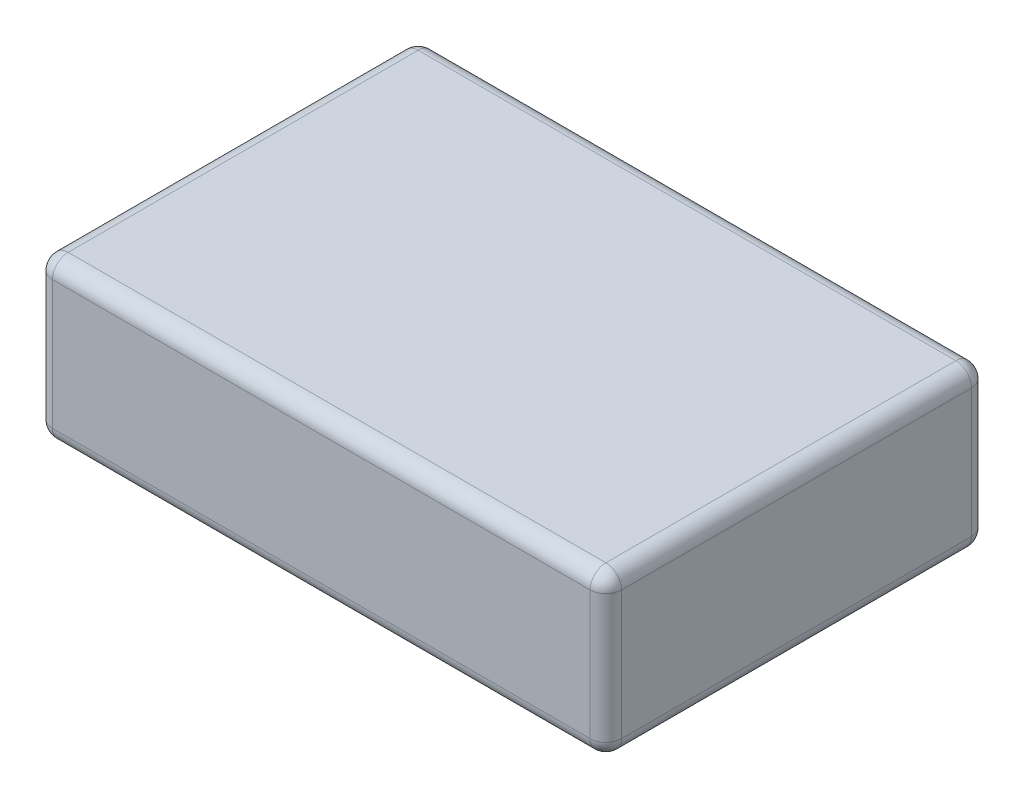
ISO-10303-21;
HEADER;
FILE_DESCRIPTION(('STEP AP214'),'2;1');
FILE_NAME('part.step','',(''),(''),'','','');
FILE_SCHEMA(('AUTOMOTIVE_DESIGN { 1 0 10303 214 1 1 1 1 }'));
ENDSEC;
DATA;
#1=APPLICATION_CONTEXT('core data for automotive mechanical design processes');
#2=APPLICATION_PROTOCOL_DEFINITION('international standard','automotive_design',2000,#1);
#3=PRODUCT_CONTEXT('',#1,'mechanical');
#4=PRODUCT('Part','Part','',(#3));
#5=PRODUCT_RELATED_PRODUCT_CATEGORY('part','',(#4));
#6=PRODUCT_DEFINITION_FORMATION('','',#4);
#7=PRODUCT_DEFINITION_CONTEXT('part definition',#1,'design');
#8=PRODUCT_DEFINITION('design','',#6,#7);
#9=PRODUCT_DEFINITION_SHAPE('','',#8);
#10=(LENGTH_UNIT() NAMED_UNIT(*) SI_UNIT(.MILLI.,.METRE.));
#11=(NAMED_UNIT(*) PLANE_ANGLE_UNIT() SI_UNIT($,.RADIAN.));
#12=(NAMED_UNIT(*) SI_UNIT($,.STERADIAN.) SOLID_ANGLE_UNIT());
#13=UNCERTAINTY_MEASURE_WITH_UNIT(LENGTH_MEASURE(1.E-05),#10,'distance_accuracy_value','');
#14=(GEOMETRIC_REPRESENTATION_CONTEXT(3) GLOBAL_UNCERTAINTY_ASSIGNED_CONTEXT((#13)) GLOBAL_UNIT_ASSIGNED_CONTEXT((#10,
#11,#12)) REPRESENTATION_CONTEXT('',''));
#15=CARTESIAN_POINT('',(0.,0.,0.));
#16=DIRECTION('',(0.,0.,1.));
#17=DIRECTION('',(1.,0.,0.));
#18=AXIS2_PLACEMENT_3D('',#15,#16,#17);
#19=CARTESIAN_POINT('',(46.0121,25.908,-30.8356));
#20=DIRECTION('',(-1.,0.,0.));
#21=DIRECTION('',(0.,0.,1.));
#22=AXIS2_PLACEMENT_3D('',#19,#20,#21);
#23=PLANE('',#22);
#24=DIRECTION('',(0.,0.,-1.));
#25=VECTOR('',#24,1.);
#26=CARTESIAN_POINT('',(46.0121,2.54,-30.8356));
#27=LINE('',#26,#25);
#28=CARTESIAN_POINT('',(46.0121,2.54,28.2956));
#29=VERTEX_POINT('',#28);
#30=CARTESIAN_POINT('',(46.0121,2.54,-28.2956));
#31=VERTEX_POINT('',#30);
#32=EDGE_CURVE('E188',#29,#31,#27,.T.);
#33=ORIENTED_EDGE('',*,*,#32,.T.);
#34=DIRECTION('',(0.,-1.,0.));
#35=VECTOR('',#34,1.);
#36=CARTESIAN_POINT('',(46.0121,25.908,-28.2956));
#37=LINE('',#36,#35);
#38=CARTESIAN_POINT('',(46.0121,23.368,-28.2956));
#39=VERTEX_POINT('',#38);
#40=EDGE_CURVE('E190',#31,#39,#37,.F.);
#41=ORIENTED_EDGE('',*,*,#40,.T.);
#42=DIRECTION('',(0.,0.,-1.));
#43=VECTOR('',#42,1.);
#44=CARTESIAN_POINT('',(46.0121,23.368,30.8356));
#45=LINE('',#44,#43);
#46=CARTESIAN_POINT('',(46.0121,23.368,28.2956));
#47=VERTEX_POINT('',#46);
#48=EDGE_CURVE('E186',#39,#47,#45,.F.);
#49=ORIENTED_EDGE('',*,*,#48,.T.);
#50=DIRECTION('',(0.,-1.,0.));
#51=VECTOR('',#50,1.);
#52=CARTESIAN_POINT('',(46.0121,25.908,28.2956));
#53=LINE('',#52,#51);
#54=EDGE_CURVE('E184',#47,#29,#53,.T.);
#55=ORIENTED_EDGE('',*,*,#54,.T.);
#56=EDGE_LOOP('',(#33,#41,#49,#55));
#57=FACE_BOUND('',#56,.T.);
#58=ADVANCED_FACE('F33',(#57),#23,.F.);
#59=CARTESIAN_POINT('',(-46.0121,25.908,-30.8356));
#60=DIRECTION('',(0.,0.,1.));
#61=DIRECTION('',(1.,0.,0.));
#62=AXIS2_PLACEMENT_3D('',#59,#60,#61);
#63=PLANE('',#62);
#64=DIRECTION('',(-1.,0.,0.));
#65=VECTOR('',#64,1.);
#66=CARTESIAN_POINT('',(-46.0121,2.54,-30.8356));
#67=LINE('',#66,#65);
#68=CARTESIAN_POINT('',(43.4721,2.54,-30.8356));
#69=VERTEX_POINT('',#68);
#70=CARTESIAN_POINT('',(-43.4721,2.54,-30.8356));
#71=VERTEX_POINT('',#70);
#72=EDGE_CURVE('E179',#69,#71,#67,.T.);
#73=ORIENTED_EDGE('',*,*,#72,.T.);
#74=DIRECTION('',(0.,-1.,0.));
#75=VECTOR('',#74,1.);
#76=CARTESIAN_POINT('',(-43.4721,25.908,-30.8356));
#77=LINE('',#76,#75);
#78=CARTESIAN_POINT('',(-43.4721,23.368,-30.8356));
#79=VERTEX_POINT('',#78);
#80=EDGE_CURVE('E181',#71,#79,#77,.F.);
#81=ORIENTED_EDGE('',*,*,#80,.T.);
#82=DIRECTION('',(-1.,0.,0.));
#83=VECTOR('',#82,1.);
#84=CARTESIAN_POINT('',(46.0121,23.368,-30.8356));
#85=LINE('',#84,#83);
#86=CARTESIAN_POINT('',(43.4721,23.368,-30.8356));
#87=VERTEX_POINT('',#86);
#88=EDGE_CURVE('E177',#79,#87,#85,.F.);
#89=ORIENTED_EDGE('',*,*,#88,.T.);
#90=DIRECTION('',(0.,-1.,0.));
#91=VECTOR('',#90,1.);
#92=CARTESIAN_POINT('',(43.4721,25.908,-30.8356));
#93=LINE('',#92,#91);
#94=EDGE_CURVE('E175',#87,#69,#93,.T.);
#95=ORIENTED_EDGE('',*,*,#94,.T.);
#96=EDGE_LOOP('',(#73,#81,#89,#95));
#97=FACE_BOUND('',#96,.T.);
#98=ADVANCED_FACE('F285',(#97),#63,.F.);
#99=CARTESIAN_POINT('',(-46.0121,25.908,-30.8356));
#100=DIRECTION('',(1.,0.,0.));
#101=DIRECTION('',(0.,0.,-1.));
#102=AXIS2_PLACEMENT_3D('',#99,#100,#101);
#103=PLANE('',#102);
#104=DIRECTION('',(0.,0.,1.));
#105=VECTOR('',#104,1.);
#106=CARTESIAN_POINT('',(-46.0121,23.368,-30.8356));
#107=LINE('',#106,#105);
#108=CARTESIAN_POINT('',(-46.0121,23.368,28.2956));
#109=VERTEX_POINT('',#108);
#110=CARTESIAN_POINT('',(-46.0121,23.368,-28.2956));
#111=VERTEX_POINT('',#110);
#112=EDGE_CURVE('E149',#109,#111,#107,.F.);
#113=ORIENTED_EDGE('',*,*,#112,.T.);
#114=DIRECTION('',(0.,-1.,0.));
#115=VECTOR('',#114,1.);
#116=CARTESIAN_POINT('',(-46.0121,25.908,-28.2956));
#117=LINE('',#116,#115);
#118=CARTESIAN_POINT('',(-46.0121,2.54,-28.2956));
#119=VERTEX_POINT('',#118);
#120=EDGE_CURVE('E153',#111,#119,#117,.T.);
#121=ORIENTED_EDGE('',*,*,#120,.T.);
#122=DIRECTION('',(0.,0.,1.));
#123=VECTOR('',#122,1.);
#124=CARTESIAN_POINT('',(-46.0121,2.54,-30.8356));
#125=LINE('',#124,#123);
#126=CARTESIAN_POINT('',(-46.0121,2.54,28.2956));
#127=VERTEX_POINT('',#126);
#128=EDGE_CURVE('E126',#119,#127,#125,.T.);
#129=ORIENTED_EDGE('',*,*,#128,.T.);
#130=DIRECTION('',(0.,-1.,0.));
#131=VECTOR('',#130,1.);
#132=CARTESIAN_POINT('',(-46.0121,25.908,28.2956));
#133=LINE('',#132,#131);
#134=EDGE_CURVE('E143',#127,#109,#133,.F.);
#135=ORIENTED_EDGE('',*,*,#134,.T.);
#136=EDGE_LOOP('',(#113,#121,#129,#135));
#137=FACE_BOUND('',#136,.T.);
#138=ADVANCED_FACE('F151',(#137),#103,.F.);
#139=CARTESIAN_POINT('',(-46.0121,25.908,30.8356));
#140=DIRECTION('',(0.,0.,-1.));
#141=DIRECTION('',(-1.,0.,0.));
#142=AXIS2_PLACEMENT_3D('',#139,#140,#141);
#143=PLANE('',#142);
#144=DIRECTION('',(1.,0.,0.));
#145=VECTOR('',#144,1.);
#146=CARTESIAN_POINT('',(-46.0121,2.54,30.8356));
#147=LINE('',#146,#145);
#148=CARTESIAN_POINT('',(-43.4721,2.54,30.8356));
#149=VERTEX_POINT('',#148);
#150=CARTESIAN_POINT('',(43.4721,2.54,30.8356));
#151=VERTEX_POINT('',#150);
#152=EDGE_CURVE('E42',#149,#151,#147,.T.);
#153=ORIENTED_EDGE('',*,*,#152,.T.);
#154=DIRECTION('',(0.,-1.,0.));
#155=VECTOR('',#154,1.);
#156=CARTESIAN_POINT('',(43.4721,25.908,30.8356));
#157=LINE('',#156,#155);
#158=CARTESIAN_POINT('',(43.4721,23.368,30.8356));
#159=VERTEX_POINT('',#158);
#160=EDGE_CURVE('E11',#151,#159,#157,.F.);
#161=ORIENTED_EDGE('',*,*,#160,.T.);
#162=DIRECTION('',(1.,0.,0.));
#163=VECTOR('',#162,1.);
#164=CARTESIAN_POINT('',(-46.0121,23.368,30.8356));
#165=LINE('',#164,#163);
#166=CARTESIAN_POINT('',(-43.4721,23.368,30.8356));
#167=VERTEX_POINT('',#166);
#168=EDGE_CURVE('E193',#159,#167,#165,.F.);
#169=ORIENTED_EDGE('',*,*,#168,.T.);
#170=DIRECTION('',(0.,-1.,0.));
#171=VECTOR('',#170,1.);
#172=CARTESIAN_POINT('',(-43.4721,25.908,30.8356));
#173=LINE('',#172,#171);
#174=EDGE_CURVE('E53',#167,#149,#173,.T.);
#175=ORIENTED_EDGE('',*,*,#174,.T.);
#176=EDGE_LOOP('',(#153,#161,#169,#175));
#177=FACE_BOUND('',#176,.T.);
#178=ADVANCED_FACE('F312',(#177),#143,.F.);
#179=CARTESIAN_POINT('',(0.,25.908,0.));
#180=DIRECTION('',(0.,1.,0.));
#181=DIRECTION('',(0.,0.,1.));
#182=AXIS2_PLACEMENT_3D('',#179,#180,#181);
#183=PLANE('',#182);
#184=DIRECTION('',(-1.,0.,0.));
#185=VECTOR('',#184,1.);
#186=CARTESIAN_POINT('',(-46.0121,25.908,-28.2956));
#187=LINE('',#186,#185);
#188=CARTESIAN_POINT('',(43.4721,25.908,-28.2956));
#189=VERTEX_POINT('',#188);
#190=CARTESIAN_POINT('',(-43.4721,25.908,-28.2956));
#191=VERTEX_POINT('',#190);
#192=EDGE_CURVE('E170',#189,#191,#187,.T.);
#193=ORIENTED_EDGE('',*,*,#192,.T.);
#194=DIRECTION('',(0.,0.,1.));
#195=VECTOR('',#194,1.);
#196=CARTESIAN_POINT('',(-43.4721,25.908,30.8356));
#197=LINE('',#196,#195);
#198=CARTESIAN_POINT('',(-43.4721,25.908,28.2956));
#199=VERTEX_POINT('',#198);
#200=EDGE_CURVE('E172',#191,#199,#197,.T.);
#201=ORIENTED_EDGE('',*,*,#200,.T.);
#202=DIRECTION('',(1.,0.,0.));
#203=VECTOR('',#202,1.);
#204=CARTESIAN_POINT('',(46.0121,25.908,28.2956));
#205=LINE('',#204,#203);
#206=CARTESIAN_POINT('',(43.4721,25.908,28.2956));
#207=VERTEX_POINT('',#206);
#208=EDGE_CURVE('E166',#199,#207,#205,.T.);
#209=ORIENTED_EDGE('',*,*,#208,.T.);
#210=DIRECTION('',(0.,0.,-1.));
#211=VECTOR('',#210,1.);
#212=CARTESIAN_POINT('',(43.4721,25.908,-30.8356));
#213=LINE('',#212,#211);
#214=EDGE_CURVE('E168',#207,#189,#213,.T.);
#215=ORIENTED_EDGE('',*,*,#214,.T.);
#216=EDGE_LOOP('',(#193,#201,#209,#215));
#217=FACE_BOUND('',#216,.T.);
#218=ADVANCED_FACE('F299',(#217),#183,.T.);
#219=CARTESIAN_POINT('',(0.,0.,0.));
#220=DIRECTION('',(0.,1.,0.));
#221=DIRECTION('',(0.,0.,1.));
#222=AXIS2_PLACEMENT_3D('',#219,#220,#221);
#223=PLANE('',#222);
#224=DIRECTION('',(1.,0.,0.));
#225=VECTOR('',#224,1.);
#226=CARTESIAN_POINT('',(0.,0.,28.2956));
#227=LINE('',#226,#225);
#228=CARTESIAN_POINT('',(43.4721,0.,28.2956));
#229=VERTEX_POINT('',#228);
#230=CARTESIAN_POINT('',(-43.4721,0.,28.2956));
#231=VERTEX_POINT('',#230);
#232=EDGE_CURVE('E156',#229,#231,#227,.F.);
#233=ORIENTED_EDGE('',*,*,#232,.T.);
#234=DIRECTION('',(0.,0.,1.));
#235=VECTOR('',#234,1.);
#236=CARTESIAN_POINT('',(-43.4721,0.,0.));
#237=LINE('',#236,#235);
#238=CARTESIAN_POINT('',(-43.4721,0.,-28.2956));
#239=VERTEX_POINT('',#238);
#240=EDGE_CURVE('E128',#231,#239,#237,.F.);
#241=ORIENTED_EDGE('',*,*,#240,.T.);
#242=DIRECTION('',(-1.,0.,0.));
#243=VECTOR('',#242,1.);
#244=CARTESIAN_POINT('',(0.,0.,-28.2956));
#245=LINE('',#244,#243);
#246=CARTESIAN_POINT('',(43.4721,0.,-28.2956));
#247=VERTEX_POINT('',#246);
#248=EDGE_CURVE('E163',#239,#247,#245,.F.);
#249=ORIENTED_EDGE('',*,*,#248,.T.);
#250=DIRECTION('',(0.,0.,-1.));
#251=VECTOR('',#250,1.);
#252=CARTESIAN_POINT('',(43.4721,0.,0.));
#253=LINE('',#252,#251);
#254=EDGE_CURVE('E161',#247,#229,#253,.F.);
#255=ORIENTED_EDGE('',*,*,#254,.T.);
#256=EDGE_LOOP('',(#233,#241,#249,#255));
#257=FACE_BOUND('',#256,.T.);
#258=ADVANCED_FACE('F319',(#257),#223,.F.);
#259=CARTESIAN_POINT('',(43.4721,23.368,0.));
#260=DIRECTION('',(0.,0.,1.));
#261=DIRECTION('',(1.,0.,0.));
#262=AXIS2_PLACEMENT_3D('',#259,#260,#261);
#263=CYLINDRICAL_SURFACE('',#262,2.54);
#264=CARTESIAN_POINT('',(43.4721,23.368,-28.2956));
#265=DIRECTION('',(0.,0.,-1.));
#266=DIRECTION('',(-1.,0.,0.));
#267=AXIS2_PLACEMENT_3D('',#264,#265,#266);
#268=CIRCLE('',#267,2.54);
#269=EDGE_CURVE('E37',#189,#39,#268,.T.);
#270=ORIENTED_EDGE('',*,*,#269,.F.);
#271=ORIENTED_EDGE('',*,*,#214,.F.);
#272=CARTESIAN_POINT('',(43.4721,23.368,28.2956));
#273=DIRECTION('',(0.,0.,1.));
#274=DIRECTION('',(0.,-1.,0.));
#275=AXIS2_PLACEMENT_3D('',#272,#273,#274);
#276=CIRCLE('',#275,2.54);
#277=EDGE_CURVE('E246',#47,#207,#276,.T.);
#278=ORIENTED_EDGE('',*,*,#277,.F.);
#279=ORIENTED_EDGE('',*,*,#48,.F.);
#280=EDGE_LOOP('',(#270,#271,#278,#279));
#281=FACE_BOUND('',#280,.T.);
#282=ADVANCED_FACE('F35',(#281),#263,.T.);
#283=CARTESIAN_POINT('',(43.4721,23.368,-28.2956));
#284=DIRECTION('',(0.,0.,1.));
#285=DIRECTION('',(1.,0.,0.));
#286=AXIS2_PLACEMENT_3D('',#283,#284,#285);
#287=SPHERICAL_SURFACE('',#286,2.54);
#288=CARTESIAN_POINT('',(43.4721,23.368,-28.2956));
#289=DIRECTION('',(1.,0.,0.));
#290=DIRECTION('',(0.,1.,0.));
#291=AXIS2_PLACEMENT_3D('',#288,#289,#290);
#292=CIRCLE('',#291,2.54);
#293=EDGE_CURVE('E242',#189,#87,#292,.F.);
#294=ORIENTED_EDGE('',*,*,#293,.F.);
#295=ORIENTED_EDGE('',*,*,#269,.T.);
#296=CARTESIAN_POINT('',(43.4721,23.368,-28.2956));
#297=DIRECTION('',(0.,1.,0.));
#298=DIRECTION('',(0.,0.,1.));
#299=AXIS2_PLACEMENT_3D('',#296,#297,#298);
#300=CIRCLE('',#299,2.54);
#301=EDGE_CURVE('E245',#87,#39,#300,.F.);
#302=ORIENTED_EDGE('',*,*,#301,.F.);
#303=EDGE_LOOP('',(#294,#295,#302));
#304=FACE_BOUND('',#303,.T.);
#305=ADVANCED_FACE('F258',(#304),#287,.T.);
#306=CARTESIAN_POINT('',(43.4721,23.368,28.2956));
#307=DIRECTION('',(0.,0.,1.));
#308=DIRECTION('',(1.,0.,0.));
#309=AXIS2_PLACEMENT_3D('',#306,#307,#308);
#310=SPHERICAL_SURFACE('',#309,2.54);
#311=CARTESIAN_POINT('',(43.4721,23.368,28.2956));
#312=DIRECTION('',(0.,1.,0.));
#313=DIRECTION('',(0.,0.,1.));
#314=AXIS2_PLACEMENT_3D('',#311,#312,#313);
#315=CIRCLE('',#314,2.54);
#316=EDGE_CURVE('E236',#47,#159,#315,.F.);
#317=ORIENTED_EDGE('',*,*,#316,.F.);
#318=ORIENTED_EDGE('',*,*,#277,.T.);
#319=CARTESIAN_POINT('',(43.4721,23.368,28.2956));
#320=DIRECTION('',(1.,0.,0.));
#321=DIRECTION('',(0.,0.,-1.));
#322=AXIS2_PLACEMENT_3D('',#319,#320,#321);
#323=CIRCLE('',#322,2.54);
#324=EDGE_CURVE('E239',#159,#207,#323,.F.);
#325=ORIENTED_EDGE('',*,*,#324,.F.);
#326=EDGE_LOOP('',(#317,#318,#325));
#327=FACE_BOUND('',#326,.T.);
#328=ADVANCED_FACE('F308',(#327),#310,.T.);
#329=CARTESIAN_POINT('',(43.4721,25.908,-28.2956));
#330=DIRECTION('',(0.,-1.,0.));
#331=DIRECTION('',(0.,0.,-1.));
#332=AXIS2_PLACEMENT_3D('',#329,#330,#331);
#333=CYLINDRICAL_SURFACE('',#332,2.54);
#334=ORIENTED_EDGE('',*,*,#301,.T.);
#335=ORIENTED_EDGE('',*,*,#40,.F.);
#336=CARTESIAN_POINT('',(43.4721,2.54,-28.2956));
#337=DIRECTION('',(0.,-1.,0.));
#338=DIRECTION('',(0.,0.,-1.));
#339=AXIS2_PLACEMENT_3D('',#336,#337,#338);
#340=CIRCLE('',#339,2.54);
#341=EDGE_CURVE('E230',#69,#31,#340,.T.);
#342=ORIENTED_EDGE('',*,*,#341,.F.);
#343=ORIENTED_EDGE('',*,*,#94,.F.);
#344=EDGE_LOOP('',(#334,#335,#342,#343));
#345=FACE_BOUND('',#344,.T.);
#346=ADVANCED_FACE('F269',(#345),#333,.T.);
#347=CARTESIAN_POINT('',(0.,23.368,-28.2956));
#348=DIRECTION('',(1.,0.,0.));
#349=DIRECTION('',(0.,0.,-1.));
#350=AXIS2_PLACEMENT_3D('',#347,#348,#349);
#351=CYLINDRICAL_SURFACE('',#350,2.54);
#352=ORIENTED_EDGE('',*,*,#293,.T.);
#353=ORIENTED_EDGE('',*,*,#88,.F.);
#354=CARTESIAN_POINT('',(-43.4721,23.368,-28.2956));
#355=DIRECTION('',(-1.,0.,0.));
#356=DIRECTION('',(0.,0.,1.));
#357=AXIS2_PLACEMENT_3D('',#354,#355,#356);
#358=CIRCLE('',#357,2.54);
#359=EDGE_CURVE('E227',#191,#79,#358,.T.);
#360=ORIENTED_EDGE('',*,*,#359,.F.);
#361=ORIENTED_EDGE('',*,*,#192,.F.);
#362=EDGE_LOOP('',(#352,#353,#360,#361));
#363=FACE_BOUND('',#362,.T.);
#364=ADVANCED_FACE('F296',(#363),#351,.T.);
#365=CARTESIAN_POINT('',(-43.4721,23.368,0.));
#366=DIRECTION('',(0.,0.,-1.));
#367=DIRECTION('',(-1.,0.,0.));
#368=AXIS2_PLACEMENT_3D('',#365,#366,#367);
#369=CYLINDRICAL_SURFACE('',#368,2.54);
#370=CARTESIAN_POINT('',(-43.4721,23.368,28.2956));
#371=DIRECTION('',(0.,0.,1.));
#372=DIRECTION('',(1.,0.,0.));
#373=AXIS2_PLACEMENT_3D('',#370,#371,#372);
#374=CIRCLE('',#373,2.54);
#375=EDGE_CURVE('E221',#199,#109,#374,.T.);
#376=ORIENTED_EDGE('',*,*,#375,.F.);
#377=ORIENTED_EDGE('',*,*,#200,.F.);
#378=CARTESIAN_POINT('',(-43.4721,23.368,-28.2956));
#379=DIRECTION('',(0.,0.,-1.));
#380=DIRECTION('',(-1.,0.,0.));
#381=AXIS2_PLACEMENT_3D('',#378,#379,#380);
#382=CIRCLE('',#381,2.54);
#383=EDGE_CURVE('E224',#111,#191,#382,.T.);
#384=ORIENTED_EDGE('',*,*,#383,.F.);
#385=ORIENTED_EDGE('',*,*,#112,.F.);
#386=EDGE_LOOP('',(#376,#377,#384,#385));
#387=FACE_BOUND('',#386,.T.);
#388=ADVANCED_FACE('F302',(#387),#369,.T.);
#389=CARTESIAN_POINT('',(0.,23.368,28.2956));
#390=DIRECTION('',(-1.,0.,0.));
#391=DIRECTION('',(0.,0.,1.));
#392=AXIS2_PLACEMENT_3D('',#389,#390,#391);
#393=CYLINDRICAL_SURFACE('',#392,2.54);
#394=ORIENTED_EDGE('',*,*,#324,.T.);
#395=ORIENTED_EDGE('',*,*,#208,.F.);
#396=CARTESIAN_POINT('',(-43.4721,23.368,28.2956));
#397=DIRECTION('',(-1.,0.,0.));
#398=DIRECTION('',(0.,0.,1.));
#399=AXIS2_PLACEMENT_3D('',#396,#397,#398);
#400=CIRCLE('',#399,2.54);
#401=EDGE_CURVE('E219',#167,#199,#400,.T.);
#402=ORIENTED_EDGE('',*,*,#401,.F.);
#403=ORIENTED_EDGE('',*,*,#168,.F.);
#404=EDGE_LOOP('',(#394,#395,#402,#403));
#405=FACE_BOUND('',#404,.T.);
#406=ADVANCED_FACE('F307',(#405),#393,.T.);
#407=CARTESIAN_POINT('',(43.4721,25.908,28.2956));
#408=DIRECTION('',(0.,-1.,0.));
#409=DIRECTION('',(0.,0.,-1.));
#410=AXIS2_PLACEMENT_3D('',#407,#408,#409);
#411=CYLINDRICAL_SURFACE('',#410,2.54);
#412=ORIENTED_EDGE('',*,*,#316,.T.);
#413=ORIENTED_EDGE('',*,*,#160,.F.);
#414=CARTESIAN_POINT('',(43.4721,2.54,28.2956));
#415=DIRECTION('',(0.,-1.,0.));
#416=DIRECTION('',(0.,0.,-1.));
#417=AXIS2_PLACEMENT_3D('',#414,#415,#416);
#418=CIRCLE('',#417,2.54);
#419=EDGE_CURVE('E216',#29,#151,#418,.T.);
#420=ORIENTED_EDGE('',*,*,#419,.F.);
#421=ORIENTED_EDGE('',*,*,#54,.F.);
#422=EDGE_LOOP('',(#412,#413,#420,#421));
#423=FACE_BOUND('',#422,.T.);
#424=ADVANCED_FACE('F311',(#423),#411,.T.);
#425=CARTESIAN_POINT('',(43.4721,2.54,-30.8356));
#426=DIRECTION('',(0.,0.,-1.));
#427=DIRECTION('',(-1.,0.,0.));
#428=AXIS2_PLACEMENT_3D('',#425,#426,#427);
#429=CYLINDRICAL_SURFACE('',#428,2.54);
#430=CARTESIAN_POINT('',(43.4721,2.54,-28.2956));
#431=DIRECTION('',(0.,0.,-1.));
#432=DIRECTION('',(-1.,0.,0.));
#433=AXIS2_PLACEMENT_3D('',#430,#431,#432);
#434=CIRCLE('',#433,2.54);
#435=EDGE_CURVE('E233',#31,#247,#434,.T.);
#436=ORIENTED_EDGE('',*,*,#435,.F.);
#437=ORIENTED_EDGE('',*,*,#32,.F.);
#438=CARTESIAN_POINT('',(43.4721,2.54,28.2956));
#439=DIRECTION('',(0.,0.,1.));
#440=DIRECTION('',(1.,0.,0.));
#441=AXIS2_PLACEMENT_3D('',#438,#439,#440);
#442=CIRCLE('',#441,2.54);
#443=EDGE_CURVE('E213',#229,#29,#442,.T.);
#444=ORIENTED_EDGE('',*,*,#443,.F.);
#445=ORIENTED_EDGE('',*,*,#254,.F.);
#446=EDGE_LOOP('',(#436,#437,#444,#445));
#447=FACE_BOUND('',#446,.T.);
#448=ADVANCED_FACE('F273',(#447),#429,.T.);
#449=CARTESIAN_POINT('',(43.4721,2.54,-28.2956));
#450=DIRECTION('',(0.,0.,1.));
#451=DIRECTION('',(1.,0.,0.));
#452=AXIS2_PLACEMENT_3D('',#449,#450,#451);
#453=SPHERICAL_SURFACE('',#452,2.54);
#454=ORIENTED_EDGE('',*,*,#341,.T.);
#455=ORIENTED_EDGE('',*,*,#435,.T.);
#456=CARTESIAN_POINT('',(43.4721,2.54,-28.2956));
#457=DIRECTION('',(1.,0.,0.));
#458=DIRECTION('',(0.,0.,-1.));
#459=AXIS2_PLACEMENT_3D('',#456,#457,#458);
#460=CIRCLE('',#459,2.54);
#461=EDGE_CURVE('E210',#69,#247,#460,.F.);
#462=ORIENTED_EDGE('',*,*,#461,.F.);
#463=EDGE_LOOP('',(#454,#455,#462));
#464=FACE_BOUND('',#463,.T.);
#465=ADVANCED_FACE('F277',(#464),#453,.T.);
#466=CARTESIAN_POINT('',(-43.4721,23.368,-28.2956));
#467=DIRECTION('',(0.,0.,1.));
#468=DIRECTION('',(1.,0.,0.));
#469=AXIS2_PLACEMENT_3D('',#466,#467,#468);
#470=SPHERICAL_SURFACE('',#469,2.54);
#471=ORIENTED_EDGE('',*,*,#383,.T.);
#472=ORIENTED_EDGE('',*,*,#359,.T.);
#473=CARTESIAN_POINT('',(-43.4721,23.368,-28.2956));
#474=DIRECTION('',(0.,1.,0.));
#475=DIRECTION('',(0.,0.,1.));
#476=AXIS2_PLACEMENT_3D('',#473,#474,#475);
#477=CIRCLE('',#476,2.54);
#478=EDGE_CURVE('E208',#111,#79,#477,.F.);
#479=ORIENTED_EDGE('',*,*,#478,.F.);
#480=EDGE_LOOP('',(#471,#472,#479));
#481=FACE_BOUND('',#480,.T.);
#482=ADVANCED_FACE('F293',(#481),#470,.T.);
#483=CARTESIAN_POINT('',(-43.4721,23.368,28.2956));
#484=DIRECTION('',(0.,0.,1.));
#485=DIRECTION('',(1.,0.,0.));
#486=AXIS2_PLACEMENT_3D('',#483,#484,#485);
#487=SPHERICAL_SURFACE('',#486,2.54);
#488=ORIENTED_EDGE('',*,*,#401,.T.);
#489=ORIENTED_EDGE('',*,*,#375,.T.);
#490=CARTESIAN_POINT('',(-43.4721,23.368,28.2956));
#491=DIRECTION('',(0.,1.,0.));
#492=DIRECTION('',(0.,0.,1.));
#493=AXIS2_PLACEMENT_3D('',#490,#491,#492);
#494=CIRCLE('',#493,2.54);
#495=EDGE_CURVE('E146',#167,#109,#494,.F.);
#496=ORIENTED_EDGE('',*,*,#495,.F.);
#497=EDGE_LOOP('',(#488,#489,#496));
#498=FACE_BOUND('',#497,.T.);
#499=ADVANCED_FACE('F351',(#498),#487,.T.);
#500=CARTESIAN_POINT('',(43.4721,2.54,28.2956));
#501=DIRECTION('',(0.,0.,1.));
#502=DIRECTION('',(1.,0.,0.));
#503=AXIS2_PLACEMENT_3D('',#500,#501,#502);
#504=SPHERICAL_SURFACE('',#503,2.54);
#505=ORIENTED_EDGE('',*,*,#443,.T.);
#506=ORIENTED_EDGE('',*,*,#419,.T.);
#507=CARTESIAN_POINT('',(43.4721,2.54,28.2956));
#508=DIRECTION('',(1.,0.,0.));
#509=DIRECTION('',(0.,0.,-1.));
#510=AXIS2_PLACEMENT_3D('',#507,#508,#509);
#511=CIRCLE('',#510,2.54);
#512=EDGE_CURVE('E204',#229,#151,#511,.F.);
#513=ORIENTED_EDGE('',*,*,#512,.F.);
#514=EDGE_LOOP('',(#505,#506,#513));
#515=FACE_BOUND('',#514,.T.);
#516=ADVANCED_FACE('F348',(#515),#504,.T.);
#517=CARTESIAN_POINT('',(-46.0121,2.54,-28.2956));
#518=DIRECTION('',(-1.,0.,0.));
#519=DIRECTION('',(0.,0.,1.));
#520=AXIS2_PLACEMENT_3D('',#517,#518,#519);
#521=CYLINDRICAL_SURFACE('',#520,2.54);
#522=ORIENTED_EDGE('',*,*,#461,.T.);
#523=ORIENTED_EDGE('',*,*,#248,.F.);
#524=CARTESIAN_POINT('',(-43.4721,2.54,-28.2956));
#525=DIRECTION('',(-1.,0.,0.));
#526=DIRECTION('',(0.,0.,1.));
#527=AXIS2_PLACEMENT_3D('',#524,#525,#526);
#528=CIRCLE('',#527,2.54);
#529=EDGE_CURVE('E201',#71,#239,#528,.T.);
#530=ORIENTED_EDGE('',*,*,#529,.F.);
#531=ORIENTED_EDGE('',*,*,#72,.F.);
#532=EDGE_LOOP('',(#522,#523,#530,#531));
#533=FACE_BOUND('',#532,.T.);
#534=ADVANCED_FACE('F282',(#533),#521,.T.);
#535=CARTESIAN_POINT('',(-43.4721,25.908,-28.2956));
#536=DIRECTION('',(0.,-1.,0.));
#537=DIRECTION('',(0.,0.,-1.));
#538=AXIS2_PLACEMENT_3D('',#535,#536,#537);
#539=CYLINDRICAL_SURFACE('',#538,2.54);
#540=ORIENTED_EDGE('',*,*,#478,.T.);
#541=ORIENTED_EDGE('',*,*,#80,.F.);
#542=CARTESIAN_POINT('',(-43.4721,2.54,-28.2956));
#543=DIRECTION('',(0.,-1.,0.));
#544=DIRECTION('',(0.,0.,-1.));
#545=AXIS2_PLACEMENT_3D('',#542,#543,#544);
#546=CIRCLE('',#545,2.54);
#547=EDGE_CURVE('E140',#119,#71,#546,.T.);
#548=ORIENTED_EDGE('',*,*,#547,.F.);
#549=ORIENTED_EDGE('',*,*,#120,.F.);
#550=EDGE_LOOP('',(#540,#541,#548,#549));
#551=FACE_BOUND('',#550,.T.);
#552=ADVANCED_FACE('F287',(#551),#539,.T.);
#553=CARTESIAN_POINT('',(-43.4721,25.908,28.2956));
#554=DIRECTION('',(0.,-1.,0.));
#555=DIRECTION('',(0.,0.,-1.));
#556=AXIS2_PLACEMENT_3D('',#553,#554,#555);
#557=CYLINDRICAL_SURFACE('',#556,2.54);
#558=ORIENTED_EDGE('',*,*,#495,.T.);
#559=ORIENTED_EDGE('',*,*,#134,.F.);
#560=CARTESIAN_POINT('',(-43.4721,2.54,28.2956));
#561=DIRECTION('',(0.,-1.,0.));
#562=DIRECTION('',(0.,0.,-1.));
#563=AXIS2_PLACEMENT_3D('',#560,#561,#562);
#564=CIRCLE('',#563,2.54);
#565=EDGE_CURVE('E134',#149,#127,#564,.T.);
#566=ORIENTED_EDGE('',*,*,#565,.F.);
#567=ORIENTED_EDGE('',*,*,#174,.F.);
#568=EDGE_LOOP('',(#558,#559,#566,#567));
#569=FACE_BOUND('',#568,.T.);
#570=ADVANCED_FACE('F144',(#569),#557,.T.);
#571=CARTESIAN_POINT('',(-46.0121,2.54,28.2956));
#572=DIRECTION('',(1.,0.,0.));
#573=DIRECTION('',(0.,0.,-1.));
#574=AXIS2_PLACEMENT_3D('',#571,#572,#573);
#575=CYLINDRICAL_SURFACE('',#574,2.54);
#576=ORIENTED_EDGE('',*,*,#512,.T.);
#577=ORIENTED_EDGE('',*,*,#152,.F.);
#578=CARTESIAN_POINT('',(-43.4721,2.54,28.2956));
#579=DIRECTION('',(-1.,0.,0.));
#580=DIRECTION('',(0.,0.,1.));
#581=AXIS2_PLACEMENT_3D('',#578,#579,#580);
#582=CIRCLE('',#581,2.54);
#583=EDGE_CURVE('E138',#231,#149,#582,.T.);
#584=ORIENTED_EDGE('',*,*,#583,.F.);
#585=ORIENTED_EDGE('',*,*,#232,.F.);
#586=EDGE_LOOP('',(#576,#577,#584,#585));
#587=FACE_BOUND('',#586,.T.);
#588=ADVANCED_FACE('F337',(#587),#575,.T.);
#589=CARTESIAN_POINT('',(-43.4721,2.54,-28.2956));
#590=DIRECTION('',(0.,0.,1.));
#591=DIRECTION('',(1.,0.,0.));
#592=AXIS2_PLACEMENT_3D('',#589,#590,#591);
#593=SPHERICAL_SURFACE('',#592,2.54);
#594=ORIENTED_EDGE('',*,*,#547,.T.);
#595=ORIENTED_EDGE('',*,*,#529,.T.);
#596=CARTESIAN_POINT('',(-43.4721,2.54,-28.2956));
#597=DIRECTION('',(0.,0.,-1.));
#598=DIRECTION('',(-1.,0.,0.));
#599=AXIS2_PLACEMENT_3D('',#596,#597,#598);
#600=CIRCLE('',#599,2.54);
#601=EDGE_CURVE('E131',#119,#239,#600,.F.);
#602=ORIENTED_EDGE('',*,*,#601,.F.);
#603=EDGE_LOOP('',(#594,#595,#602));
#604=FACE_BOUND('',#603,.T.);
#605=ADVANCED_FACE('F334',(#604),#593,.T.);
#606=CARTESIAN_POINT('',(-43.4721,2.54,28.2956));
#607=DIRECTION('',(0.,0.,1.));
#608=DIRECTION('',(1.,0.,0.));
#609=AXIS2_PLACEMENT_3D('',#606,#607,#608);
#610=SPHERICAL_SURFACE('',#609,2.54);
#611=ORIENTED_EDGE('',*,*,#583,.T.);
#612=ORIENTED_EDGE('',*,*,#565,.T.);
#613=CARTESIAN_POINT('',(-43.4721,2.54,28.2956));
#614=DIRECTION('',(0.,0.,1.));
#615=DIRECTION('',(1.,0.,0.));
#616=AXIS2_PLACEMENT_3D('',#613,#614,#615);
#617=CIRCLE('',#616,2.54);
#618=EDGE_CURVE('E122',#231,#127,#617,.F.);
#619=ORIENTED_EDGE('',*,*,#618,.F.);
#620=EDGE_LOOP('',(#611,#612,#619));
#621=FACE_BOUND('',#620,.T.);
#622=ADVANCED_FACE('F136',(#621),#610,.T.);
#623=CARTESIAN_POINT('',(-43.4721,2.54,-30.8356));
#624=DIRECTION('',(0.,0.,1.));
#625=DIRECTION('',(1.,0.,0.));
#626=AXIS2_PLACEMENT_3D('',#623,#624,#625);
#627=CYLINDRICAL_SURFACE('',#626,2.54);
#628=ORIENTED_EDGE('',*,*,#601,.T.);
#629=ORIENTED_EDGE('',*,*,#240,.F.);
#630=ORIENTED_EDGE('',*,*,#618,.T.);
#631=ORIENTED_EDGE('',*,*,#128,.F.);
#632=EDGE_LOOP('',(#628,#629,#630,#631));
#633=FACE_BOUND('',#632,.T.);
#634=ADVANCED_FACE('F124',(#633),#627,.T.);
#635=CLOSED_SHELL('',(#58,#98,#138,#178,#218,#258,#282,#305,#328,#346,#364,#388,#406,#424,#448,
#465,#482,#499,#516,#534,#552,#570,#588,#605,#622,#634));
#636=MANIFOLD_SOLID_BREP('B2',#635);
#637=ADVANCED_BREP_SHAPE_REPRESENTATION('',(#18,#636),#14);
#638=SHAPE_DEFINITION_REPRESENTATION(#9,#637);
ENDSEC;
END-ISO-10303-21;
